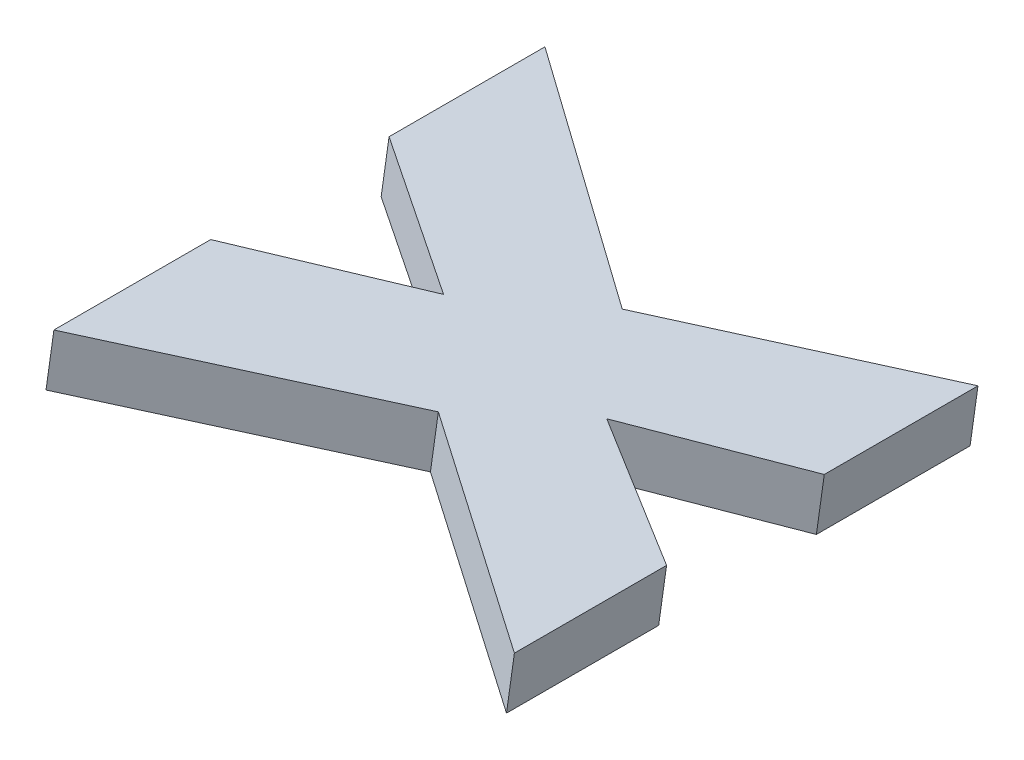
ISO-10303-21;
HEADER;
FILE_DESCRIPTION(('STEP AP214'),'2;1');
FILE_NAME('part.step','',(''),(''),'','','');
FILE_SCHEMA(('AUTOMOTIVE_DESIGN { 1 0 10303 214 1 1 1 1 }'));
ENDSEC;
DATA;
#1=APPLICATION_CONTEXT('core data for automotive mechanical design processes');
#2=APPLICATION_PROTOCOL_DEFINITION('international standard','automotive_design',2000,#1);
#3=PRODUCT_CONTEXT('',#1,'mechanical');
#4=PRODUCT('Part','Part','',(#3));
#5=PRODUCT_RELATED_PRODUCT_CATEGORY('part','',(#4));
#6=PRODUCT_DEFINITION_FORMATION('','',#4);
#7=PRODUCT_DEFINITION_CONTEXT('part definition',#1,'design');
#8=PRODUCT_DEFINITION('design','',#6,#7);
#9=PRODUCT_DEFINITION_SHAPE('','',#8);
#10=(LENGTH_UNIT() NAMED_UNIT(*) SI_UNIT(.MILLI.,.METRE.));
#11=(NAMED_UNIT(*) PLANE_ANGLE_UNIT() SI_UNIT($,.RADIAN.));
#12=(NAMED_UNIT(*) SI_UNIT($,.STERADIAN.) SOLID_ANGLE_UNIT());
#13=UNCERTAINTY_MEASURE_WITH_UNIT(LENGTH_MEASURE(1.E-05),#10,'distance_accuracy_value','');
#14=(GEOMETRIC_REPRESENTATION_CONTEXT(3) GLOBAL_UNCERTAINTY_ASSIGNED_CONTEXT((#13)) GLOBAL_UNIT_ASSIGNED_CONTEXT((#10,
#11,#12)) REPRESENTATION_CONTEXT('',''));
#15=CARTESIAN_POINT('',(0.,0.,0.));
#16=DIRECTION('',(0.,0.,1.));
#17=DIRECTION('',(1.,0.,0.));
#18=AXIS2_PLACEMENT_3D('',#15,#16,#17);
#19=CARTESIAN_POINT('',(883.709478255438,611.568026201514,1736.03406550126));
#20=DIRECTION('',(0.990268068741567,-0.139173100960088,0.));
#21=DIRECTION('',(-0.000106014336860249,-0.000754331202663265,-0.999999709872657));
#22=AXIS2_PLACEMENT_3D('',#19,#20,#21);
#23=PLANE('',#22);
#24=CARTESIAN_POINT('',(882.317747649617,601.665348387136,1736.04168294573));
#25=CARTESIAN_POINT('',(882.319191064462,601.675618817426,1749.65695866815));
#26=CARTESIAN_POINT('',(882.320634479308,601.685889247716,1763.27223439056));
#27=B_SPLINE_CURVE_WITH_KNOTS('',2,(#24,#25,#26),.UNSPECIFIED.,.F.,.F.,(3,3),(0.,1.),.UNSPECIFIED.);
#28=CARTESIAN_POINT('',(882.317747649617,601.665348387136,1736.04168294573));
#29=VERTEX_POINT('',#28);
#30=CARTESIAN_POINT('',(882.320634479308,601.685889247716,1763.27223439056));
#31=VERTEX_POINT('',#30);
#32=EDGE_CURVE('E146',#29,#31,#27,.T.);
#33=ORIENTED_EDGE('',*,*,#32,.F.);
#34=DIRECTION('',(-0.139173060582166,-0.990267781437723,0.000761744447259926));
#35=VECTOR('',#34,1.);
#36=CARTESIAN_POINT('',(883.709478255438,611.568026201514,1736.03406550126));
#37=LINE('',#36,#35);
#38=CARTESIAN_POINT('',(883.709478255438,611.568026201514,1736.03406550126));
#39=VERTEX_POINT('',#38);
#40=EDGE_CURVE('E33',#39,#29,#37,.T.);
#41=ORIENTED_EDGE('',*,*,#40,.F.);
#42=CARTESIAN_POINT('',(883.709478255438,611.568026201514,1736.03406550126));
#43=CARTESIAN_POINT('',(883.710921670284,611.578296631803,1749.64934122368));
#44=CARTESIAN_POINT('',(883.71236508513,611.588567062094,1763.26461694608));
#45=B_SPLINE_CURVE_WITH_KNOTS('',2,(#42,#43,#44),.UNSPECIFIED.,.F.,.F.,(3,3),(0.,1.),.UNSPECIFIED.);
#46=CARTESIAN_POINT('',(883.71236508513,611.588567062094,1763.26461694608));
#47=VERTEX_POINT('',#46);
#48=EDGE_CURVE('E238',#39,#47,#45,.T.);
#49=ORIENTED_EDGE('',*,*,#48,.T.);
#50=DIRECTION('',(-0.139173060582166,-0.990267781437723,0.000761744447259926));
#51=VECTOR('',#50,1.);
#52=CARTESIAN_POINT('',(883.71236508513,611.588567062094,1763.26461694608));
#53=LINE('',#52,#51);
#54=EDGE_CURVE('E11',#47,#31,#53,.T.);
#55=ORIENTED_EDGE('',*,*,#54,.T.);
#56=EDGE_LOOP('',(#33,#41,#49,#55));
#57=FACE_BOUND('',#56,.T.);
#58=ADVANCED_FACE('F17',(#57),#23,.T.);
#59=CARTESIAN_POINT('',(883.71236508513,611.588567062094,1763.26461694608));
#60=DIRECTION('',(0.493962203964204,-0.0687551214728756,0.86676067880706));
#61=DIRECTION('',(0.85827280060772,-0.12100600942788,-0.498723716519799));
#62=AXIS2_PLACEMENT_3D('',#59,#60,#61);
#63=PLANE('',#62);
#64=CARTESIAN_POINT('',(882.320634479308,601.685889247716,1763.27223439056));
#65=CARTESIAN_POINT('',(870.135548850876,603.403837882917,1770.35272346865));
#66=CARTESIAN_POINT('',(857.950463222444,605.121786518117,1777.43321254674));
#67=B_SPLINE_CURVE_WITH_KNOTS('',2,(#64,#65,#66),.UNSPECIFIED.,.F.,.F.,(3,3),(1.,2.),.UNSPECIFIED.);
#68=CARTESIAN_POINT('',(857.950463222444,605.121786518117,1777.43321254674));
#69=VERTEX_POINT('',#68);
#70=EDGE_CURVE('E154',#31,#69,#67,.T.);
#71=ORIENTED_EDGE('',*,*,#70,.F.);
#72=ORIENTED_EDGE('',*,*,#54,.F.);
#73=CARTESIAN_POINT('',(883.71236508513,611.588567062094,1763.26461694608));
#74=CARTESIAN_POINT('',(871.527279456698,613.306515697294,1770.34510602418));
#75=CARTESIAN_POINT('',(859.342193828266,615.024464332494,1777.42559510227));
#76=B_SPLINE_CURVE_WITH_KNOTS('',2,(#73,#74,#75),.UNSPECIFIED.,.F.,.F.,(3,3),(1.,2.),.UNSPECIFIED.);
#77=CARTESIAN_POINT('',(859.342193828266,615.024464332494,1777.42559510227));
#78=VERTEX_POINT('',#77);
#79=EDGE_CURVE('E258',#47,#78,#76,.T.);
#80=ORIENTED_EDGE('',*,*,#79,.T.);
#81=DIRECTION('',(-0.139173060582166,-0.990267781437723,0.000761744447259926));
#82=VECTOR('',#81,1.);
#83=CARTESIAN_POINT('',(859.342193828266,615.024464332494,1777.42559510227));
#84=LINE('',#83,#82);
#85=EDGE_CURVE('E25',#78,#69,#84,.T.);
#86=ORIENTED_EDGE('',*,*,#85,.T.);
#87=EDGE_LOOP('',(#71,#72,#80,#86));
#88=FACE_BOUND('',#87,.T.);
#89=ADVANCED_FACE('F257',(#88),#63,.T.);
#90=CARTESIAN_POINT('',(859.342193828266,615.024464332494,1777.42559510227));
#91=DIRECTION('',(0.483668298714898,-0.0686463427631782,-0.872555245496511));
#92=DIRECTION('',(-0.864115638110102,0.121067752401911,-0.488514854740284));
#93=AXIS2_PLACEMENT_3D('',#90,#91,#92);
#94=PLANE('',#93);
#95=CARTESIAN_POINT('',(857.950463222444,605.121786518117,1777.43321254674));
#96=CARTESIAN_POINT('',(870.137029869716,603.414375879527,1784.32270577301));
#97=CARTESIAN_POINT('',(882.323596516987,601.706965240937,1791.21219899928));
#98=B_SPLINE_CURVE_WITH_KNOTS('',2,(#95,#96,#97),.UNSPECIFIED.,.F.,.F.,(3,3),(2.,3.),.UNSPECIFIED.);
#99=CARTESIAN_POINT('',(882.323596516987,601.706965240937,1791.21219899928));
#100=VERTEX_POINT('',#99);
#101=EDGE_CURVE('E162',#69,#100,#98,.T.);
#102=ORIENTED_EDGE('',*,*,#101,.F.);
#103=ORIENTED_EDGE('',*,*,#85,.F.);
#104=CARTESIAN_POINT('',(859.342193828266,615.024464332494,1777.42559510227));
#105=CARTESIAN_POINT('',(871.528760475537,613.317053693904,1784.31508832854));
#106=CARTESIAN_POINT('',(883.715327122809,611.609643055314,1791.2045815548));
#107=B_SPLINE_CURVE_WITH_KNOTS('',2,(#104,#105,#106),.UNSPECIFIED.,.F.,.F.,(3,3),(2.,3.),.UNSPECIFIED.);
#108=CARTESIAN_POINT('',(883.715327122809,611.609643055314,1791.2045815548));
#109=VERTEX_POINT('',#108);
#110=EDGE_CURVE('E267',#78,#109,#107,.T.);
#111=ORIENTED_EDGE('',*,*,#110,.T.);
#112=DIRECTION('',(-0.139173060582166,-0.990267781437723,0.000761744447259926));
#113=VECTOR('',#112,1.);
#114=CARTESIAN_POINT('',(883.715327122809,611.609643055314,1791.2045815548));
#115=LINE('',#114,#113);
#116=EDGE_CURVE('E255',#109,#100,#115,.T.);
#117=ORIENTED_EDGE('',*,*,#116,.T.);
#118=EDGE_LOOP('',(#102,#103,#111,#117));
#119=FACE_BOUND('',#118,.T.);
#120=ADVANCED_FACE('F262',(#119),#94,.T.);
#121=CARTESIAN_POINT('',(883.715327122809,611.609643055314,1791.2045815548));
#122=DIRECTION('',(0.990268068741567,-0.139173100960088,0.));
#123=DIRECTION('',(-0.000106014336867244,-0.000754331202662287,-0.999999709872657));
#124=AXIS2_PLACEMENT_3D('',#121,#122,#123);
#125=PLANE('',#124);
#126=CARTESIAN_POINT('',(882.323596516987,601.706965240937,1791.21219899928));
#127=CARTESIAN_POINT('',(882.325025468758,601.717132761103,1804.69104911325));
#128=CARTESIAN_POINT('',(882.32645442053,601.72730028127,1818.16989922722));
#129=B_SPLINE_CURVE_WITH_KNOTS('',2,(#126,#127,#128),.UNSPECIFIED.,.F.,.F.,(3,3),(3.,4.),.UNSPECIFIED.);
#130=CARTESIAN_POINT('',(882.32645442053,601.72730028127,1818.16989922722));
#131=VERTEX_POINT('',#130);
#132=EDGE_CURVE('E170',#100,#131,#129,.T.);
#133=ORIENTED_EDGE('',*,*,#132,.F.);
#134=ORIENTED_EDGE('',*,*,#116,.F.);
#135=CARTESIAN_POINT('',(883.715327122809,611.609643055314,1791.2045815548));
#136=CARTESIAN_POINT('',(883.71675607458,611.619810575481,1804.68343166878));
#137=CARTESIAN_POINT('',(883.718185026351,611.629978095648,1818.16228178275));
#138=B_SPLINE_CURVE_WITH_KNOTS('',2,(#135,#136,#137),.UNSPECIFIED.,.F.,.F.,(3,3),(3.,4.),.UNSPECIFIED.);
#139=CARTESIAN_POINT('',(883.718185026351,611.629978095648,1818.16228178275));
#140=VERTEX_POINT('',#139);
#141=EDGE_CURVE('E283',#109,#140,#138,.T.);
#142=ORIENTED_EDGE('',*,*,#141,.T.);
#143=DIRECTION('',(-0.139173060582166,-0.990267781437723,0.000761744447259926));
#144=VECTOR('',#143,1.);
#145=CARTESIAN_POINT('',(883.718185026351,611.629978095648,1818.16228178275));
#146=LINE('',#145,#144);
#147=EDGE_CURVE('E253',#140,#131,#146,.T.);
#148=ORIENTED_EDGE('',*,*,#147,.T.);
#149=EDGE_LOOP('',(#133,#134,#142,#148));
#150=FACE_BOUND('',#149,.T.);
#151=ADVANCED_FACE('F351',(#150),#125,.T.);
#152=CARTESIAN_POINT('',(883.718185026351,611.629978095648,1818.16228178275));
#153=DIRECTION('',(-0.535296448896643,0.0758781245129263,0.841249203279887));
#154=DIRECTION('',(0.833119781908242,-0.116671467235185,0.540647017680068));
#155=AXIS2_PLACEMENT_3D('',#152,#153,#154);
#156=PLANE('',#155);
#157=CARTESIAN_POINT('',(882.32645442053,601.72730028127,1818.16989922722));
#158=CARTESIAN_POINT('',(863.141223784319,604.414031596718,1805.7197834669));
#159=CARTESIAN_POINT('',(843.955993148108,607.100762912166,1793.26966770658));
#160=B_SPLINE_CURVE_WITH_KNOTS('',2,(#157,#158,#159),.UNSPECIFIED.,.F.,.F.,(3,3),(4.,5.),.UNSPECIFIED.);
#161=CARTESIAN_POINT('',(843.955993148108,607.100762912166,1793.26966770658));
#162=VERTEX_POINT('',#161);
#163=EDGE_CURVE('E178',#131,#162,#160,.T.);
#164=ORIENTED_EDGE('',*,*,#163,.F.);
#165=ORIENTED_EDGE('',*,*,#147,.F.);
#166=CARTESIAN_POINT('',(883.718185026351,611.629978095648,1818.16228178275));
#167=CARTESIAN_POINT('',(864.53295439014,614.316709411096,1805.71216602243));
#168=CARTESIAN_POINT('',(845.347723753929,617.003440726544,1793.26205026211));
#169=B_SPLINE_CURVE_WITH_KNOTS('',2,(#166,#167,#168),.UNSPECIFIED.,.F.,.F.,(3,3),(4.,5.),.UNSPECIFIED.);
#170=CARTESIAN_POINT('',(845.347723753929,617.003440726544,1793.26205026211));
#171=VERTEX_POINT('',#170);
#172=EDGE_CURVE('E291',#140,#171,#169,.T.);
#173=ORIENTED_EDGE('',*,*,#172,.T.);
#174=DIRECTION('',(-0.139173060582166,-0.990267781437723,0.000761744447259926));
#175=VECTOR('',#174,1.);
#176=CARTESIAN_POINT('',(845.347723753929,617.003440726544,1793.26205026211));
#177=LINE('',#176,#175);
#178=EDGE_CURVE('E251',#171,#162,#177,.T.);
#179=ORIENTED_EDGE('',*,*,#178,.T.);
#180=EDGE_LOOP('',(#164,#165,#173,#179));
#181=FACE_BOUND('',#180,.T.);
#182=ADVANCED_FACE('F349',(#181),#156,.T.);
#183=CARTESIAN_POINT('',(845.347723753929,617.003440726544,1793.26205026211));
#184=DIRECTION('',(0.545826370188753,-0.0760690181449896,0.834438181104525));
#185=DIRECTION('',(0.826259301197127,-0.116547095737591,-0.55110102672774));
#186=AXIS2_PLACEMENT_3D('',#183,#184,#185);
#187=PLANE('',#186);
#188=CARTESIAN_POINT('',(843.955993148108,607.100762912166,1793.26966770658));
#189=CARTESIAN_POINT('',(823.530625417097,609.981840662181,1806.89304369949));
#190=CARTESIAN_POINT('',(803.105257686087,612.862918412195,1820.51641969241));
#191=B_SPLINE_CURVE_WITH_KNOTS('',2,(#188,#189,#190),.UNSPECIFIED.,.F.,.F.,(3,3),(5.,6.),.UNSPECIFIED.);
#192=CARTESIAN_POINT('',(803.105257686087,612.862918412195,1820.51641969241));
#193=VERTEX_POINT('',#192);
#194=EDGE_CURVE('E186',#162,#193,#191,.T.);
#195=ORIENTED_EDGE('',*,*,#194,.F.);
#196=ORIENTED_EDGE('',*,*,#178,.F.);
#197=CARTESIAN_POINT('',(845.347723753929,617.003440726544,1793.26205026211));
#198=CARTESIAN_POINT('',(824.922356022919,619.884518476558,1806.88542625502));
#199=CARTESIAN_POINT('',(804.496988291909,622.765596226573,1820.50880224793));
#200=B_SPLINE_CURVE_WITH_KNOTS('',2,(#197,#198,#199),.UNSPECIFIED.,.F.,.F.,(3,3),(5.,6.),.UNSPECIFIED.);
#201=CARTESIAN_POINT('',(804.496988291909,622.765596226573,1820.50880224793));
#202=VERTEX_POINT('',#201);
#203=EDGE_CURVE('E299',#171,#202,#200,.T.);
#204=ORIENTED_EDGE('',*,*,#203,.T.);
#205=DIRECTION('',(-0.139173060582166,-0.990267781437723,0.000761744447259926));
#206=VECTOR('',#205,1.);
#207=CARTESIAN_POINT('',(804.496988291909,622.765596226573,1820.50880224793));
#208=LINE('',#207,#206);
#209=EDGE_CURVE('E249',#202,#193,#208,.T.);
#210=ORIENTED_EDGE('',*,*,#209,.T.);
#211=EDGE_LOOP('',(#195,#196,#204,#210));
#212=FACE_BOUND('',#211,.T.);
#213=ADVANCED_FACE('F344',(#212),#187,.T.);
#214=CARTESIAN_POINT('',(804.496988291909,622.765596226573,1820.50880224793));
#215=DIRECTION('',(-0.990268068741567,0.139173100960088,0.));
#216=DIRECTION('',(0.000106014336865023,0.000754331202662592,0.999999709872657));
#217=AXIS2_PLACEMENT_3D('',#214,#215,#216);
#218=PLANE('',#217);
#219=CARTESIAN_POINT('',(803.105257686087,612.862918412195,1820.51641969241));
#220=CARTESIAN_POINT('',(803.103785345092,612.852442161659,1806.62829275311));
#221=CARTESIAN_POINT('',(803.102313004098,612.841965911123,1792.74016581382));
#222=B_SPLINE_CURVE_WITH_KNOTS('',2,(#219,#220,#221),.UNSPECIFIED.,.F.,.F.,(3,3),(6.,7.),.UNSPECIFIED.);
#223=CARTESIAN_POINT('',(803.102313004098,612.841965911123,1792.74016581382));
#224=VERTEX_POINT('',#223);
#225=EDGE_CURVE('E194',#193,#224,#222,.T.);
#226=ORIENTED_EDGE('',*,*,#225,.F.);
#227=ORIENTED_EDGE('',*,*,#209,.F.);
#228=CARTESIAN_POINT('',(804.496988291909,622.765596226573,1820.50880224793));
#229=CARTESIAN_POINT('',(804.495515950914,622.755119976036,1806.62067530864));
#230=CARTESIAN_POINT('',(804.494043609919,622.7446437255,1792.73254836935));
#231=B_SPLINE_CURVE_WITH_KNOTS('',2,(#228,#229,#230),.UNSPECIFIED.,.F.,.F.,(3,3),(6.,7.),.UNSPECIFIED.);
#232=CARTESIAN_POINT('',(804.494043609919,622.7446437255,1792.73254836935));
#233=VERTEX_POINT('',#232);
#234=EDGE_CURVE('E307',#202,#233,#231,.T.);
#235=ORIENTED_EDGE('',*,*,#234,.T.);
#236=DIRECTION('',(-0.139173060582166,-0.990267781437723,0.000761744447259926));
#237=VECTOR('',#236,1.);
#238=CARTESIAN_POINT('',(804.494043609919,622.7446437255,1792.73254836935));
#239=LINE('',#238,#237);
#240=EDGE_CURVE('E247',#233,#224,#239,.T.);
#241=ORIENTED_EDGE('',*,*,#240,.T.);
#242=EDGE_LOOP('',(#226,#227,#235,#241));
#243=FACE_BOUND('',#242,.T.);
#244=ADVANCED_FACE('F341',(#243),#218,.T.);
#245=CARTESIAN_POINT('',(804.494043609919,622.7446437255,1792.73254836935));
#246=DIRECTION('',(-0.518637472025848,0.0722344067515732,-0.851937417356396));
#247=DIRECTION('',(-0.843591152051057,0.118961807012412,0.52364306226046));
#248=AXIS2_PLACEMENT_3D('',#245,#246,#247);
#249=PLANE('',#248);
#250=CARTESIAN_POINT('',(803.102313004098,612.841965911123,1792.74016581382));
#251=CARTESIAN_POINT('',(815.827703706055,611.047452693241,1784.84112308509));
#252=CARTESIAN_POINT('',(828.553094408013,609.252939475359,1776.94208035635));
#253=B_SPLINE_CURVE_WITH_KNOTS('',2,(#250,#251,#252),.UNSPECIFIED.,.F.,.F.,(3,3),(7.,8.),.UNSPECIFIED.);
#254=CARTESIAN_POINT('',(828.553094408013,609.252939475359,1776.94208035635));
#255=VERTEX_POINT('',#254);
#256=EDGE_CURVE('E202',#224,#255,#253,.T.);
#257=ORIENTED_EDGE('',*,*,#256,.F.);
#258=ORIENTED_EDGE('',*,*,#240,.F.);
#259=CARTESIAN_POINT('',(804.494043609919,622.7446437255,1792.73254836935));
#260=CARTESIAN_POINT('',(817.219434311877,620.950130507618,1784.83350564061));
#261=CARTESIAN_POINT('',(829.944825013835,619.155617289736,1776.93446291188));
#262=B_SPLINE_CURVE_WITH_KNOTS('',2,(#259,#260,#261),.UNSPECIFIED.,.F.,.F.,(3,3),(7.,8.),.UNSPECIFIED.);
#263=CARTESIAN_POINT('',(829.944825013835,619.155617289736,1776.93446291188));
#264=VERTEX_POINT('',#263);
#265=EDGE_CURVE('E315',#233,#264,#262,.T.);
#266=ORIENTED_EDGE('',*,*,#265,.T.);
#267=DIRECTION('',(-0.139173060582166,-0.990267781437723,0.000761744447259926));
#268=VECTOR('',#267,1.);
#269=CARTESIAN_POINT('',(829.944825013835,619.155617289736,1776.93446291188));
#270=LINE('',#269,#268);
#271=EDGE_CURVE('E245',#264,#255,#270,.T.);
#272=ORIENTED_EDGE('',*,*,#271,.T.);
#273=EDGE_LOOP('',(#257,#258,#266,#272));
#274=FACE_BOUND('',#273,.T.);
#275=ADVANCED_FACE('F338',(#274),#249,.T.);
#276=CARTESIAN_POINT('',(829.944825013835,619.155617289736,1776.93446291188));
#277=DIRECTION('',(-0.518456836812744,0.0735196930777261,0.851937417356393));
#278=DIRECTION('',(0.843702179427265,-0.118171806181369,0.523643062260464));
#279=AXIS2_PLACEMENT_3D('',#276,#277,#278);
#280=PLANE('',#279);
#281=CARTESIAN_POINT('',(828.553094408013,609.252939475359,1776.94208035635));
#282=CARTESIAN_POINT('',(815.826028882016,611.035535700981,1769.04303762762));
#283=CARTESIAN_POINT('',(803.098963356019,612.818131926602,1761.14399489888));
#284=B_SPLINE_CURVE_WITH_KNOTS('',2,(#281,#282,#283),.UNSPECIFIED.,.F.,.F.,(3,3),(8.,9.),.UNSPECIFIED.);
#285=CARTESIAN_POINT('',(803.098963356019,612.818131926602,1761.14399489888));
#286=VERTEX_POINT('',#285);
#287=EDGE_CURVE('E210',#255,#286,#284,.T.);
#288=ORIENTED_EDGE('',*,*,#287,.F.);
#289=ORIENTED_EDGE('',*,*,#271,.F.);
#290=CARTESIAN_POINT('',(829.944825013835,619.155617289736,1776.93446291188));
#291=CARTESIAN_POINT('',(817.217759487838,620.938213515358,1769.03542018314));
#292=CARTESIAN_POINT('',(804.49069396184,622.720809740979,1761.1363774544));
#293=B_SPLINE_CURVE_WITH_KNOTS('',2,(#290,#291,#292),.UNSPECIFIED.,.F.,.F.,(3,3),(8.,9.),.UNSPECIFIED.);
#294=CARTESIAN_POINT('',(804.49069396184,622.720809740979,1761.1363774544));
#295=VERTEX_POINT('',#294);
#296=EDGE_CURVE('E128',#264,#295,#293,.T.);
#297=ORIENTED_EDGE('',*,*,#296,.T.);
#298=DIRECTION('',(-0.139173060582166,-0.990267781437723,0.000761744447259926));
#299=VECTOR('',#298,1.);
#300=CARTESIAN_POINT('',(804.49069396184,622.720809740979,1761.1363774544));
#301=LINE('',#300,#299);
#302=EDGE_CURVE('E120',#295,#286,#301,.T.);
#303=ORIENTED_EDGE('',*,*,#302,.T.);
#304=EDGE_LOOP('',(#288,#289,#297,#303));
#305=FACE_BOUND('',#304,.T.);
#306=ADVANCED_FACE('F332',(#305),#280,.T.);
#307=CARTESIAN_POINT('',(804.49069396184,622.720809740979,1761.1363774544));
#308=DIRECTION('',(-0.990268068741567,0.139173100960088,0.));
#309=DIRECTION('',(0.000106014336863358,0.000754331202662828,0.999999709872657));
#310=AXIS2_PLACEMENT_3D('',#307,#308,#309);
#311=PLANE('',#310);
#312=CARTESIAN_POINT('',(803.098963356019,612.818131926602,1761.14399489888));
#313=CARTESIAN_POINT('',(803.097499692869,612.80771742214,1747.33772332465));
#314=CARTESIAN_POINT('',(803.096036029719,612.797302917677,1733.53145175042));
#315=B_SPLINE_CURVE_WITH_KNOTS('',2,(#312,#313,#314),.UNSPECIFIED.,.F.,.F.,(3,3),(9.,10.),.UNSPECIFIED.);
#316=CARTESIAN_POINT('',(803.096036029719,612.797302917677,1733.53145175042));
#317=VERTEX_POINT('',#316);
#318=EDGE_CURVE('E218',#286,#317,#315,.T.);
#319=ORIENTED_EDGE('',*,*,#318,.F.);
#320=ORIENTED_EDGE('',*,*,#302,.F.);
#321=CARTESIAN_POINT('',(804.49069396184,622.720809740979,1761.1363774544));
#322=CARTESIAN_POINT('',(804.48923029869,622.710395236517,1747.33010588018));
#323=CARTESIAN_POINT('',(804.48776663554,622.699980732055,1733.52383430595));
#324=B_SPLINE_CURVE_WITH_KNOTS('',2,(#321,#322,#323),.UNSPECIFIED.,.F.,.F.,(3,3),(9.,10.),.UNSPECIFIED.);
#325=CARTESIAN_POINT('',(804.48776663554,622.699980732055,1733.52383430595));
#326=VERTEX_POINT('',#325);
#327=EDGE_CURVE('E123',#295,#326,#324,.T.);
#328=ORIENTED_EDGE('',*,*,#327,.T.);
#329=DIRECTION('',(-0.139173060582166,-0.990267781437723,0.000761744447259926));
#330=VECTOR('',#329,1.);
#331=CARTESIAN_POINT('',(804.48776663554,622.699980732055,1733.52383430595));
#332=LINE('',#331,#330);
#333=EDGE_CURVE('E109',#326,#317,#332,.T.);
#334=ORIENTED_EDGE('',*,*,#333,.T.);
#335=EDGE_LOOP('',(#319,#320,#328,#334));
#336=FACE_BOUND('',#335,.T.);
#337=ADVANCED_FACE('F124',(#336),#311,.T.);
#338=CARTESIAN_POINT('',(804.48776663554,622.699980732055,1733.52383430595));
#339=DIRECTION('',(0.546482378429955,-0.0774445373825513,-0.833882098198026));
#340=DIRECTION('',(-0.825825568309515,0.115637643853603,-0.551942085775541));
#341=AXIS2_PLACEMENT_3D('',#338,#339,#340);
#342=PLANE('',#341);
#343=CARTESIAN_POINT('',(803.096036029719,612.797302917677,1733.53145175042));
#344=CARTESIAN_POINT('',(823.740467534317,609.906530932044,1747.32919672412));
#345=CARTESIAN_POINT('',(844.384899038915,607.015758946411,1761.12694169782));
#346=B_SPLINE_CURVE_WITH_KNOTS('',2,(#343,#344,#345),.UNSPECIFIED.,.F.,.F.,(3,3),(10.,11.),.UNSPECIFIED.);
#347=CARTESIAN_POINT('',(844.384899038915,607.015758946411,1761.12694169782));
#348=VERTEX_POINT('',#347);
#349=EDGE_CURVE('E116',#317,#348,#346,.T.);
#350=ORIENTED_EDGE('',*,*,#349,.F.);
#351=ORIENTED_EDGE('',*,*,#333,.F.);
#352=CARTESIAN_POINT('',(804.48776663554,622.699980732055,1733.52383430595));
#353=CARTESIAN_POINT('',(825.132198140139,619.809208746421,1747.32157927965));
#354=CARTESIAN_POINT('',(845.776629644737,616.918436760788,1761.11932425335));
#355=B_SPLINE_CURVE_WITH_KNOTS('',2,(#352,#353,#354),.UNSPECIFIED.,.F.,.F.,(3,3),(10.,11.),.UNSPECIFIED.);
#356=CARTESIAN_POINT('',(845.776629644737,616.918436760788,1761.11932425335));
#357=VERTEX_POINT('',#356);
#358=EDGE_CURVE('E113',#326,#357,#355,.T.);
#359=ORIENTED_EDGE('',*,*,#358,.T.);
#360=DIRECTION('',(-0.139173060582166,-0.990267781437723,0.000761744447259926));
#361=VECTOR('',#360,1.);
#362=CARTESIAN_POINT('',(845.776629644737,616.918436760788,1761.11932425335));
#363=LINE('',#362,#361);
#364=EDGE_CURVE('E73',#357,#348,#363,.T.);
#365=ORIENTED_EDGE('',*,*,#364,.T.);
#366=EDGE_LOOP('',(#350,#351,#359,#365));
#367=FACE_BOUND('',#366,.T.);
#368=ADVANCED_FACE('F111',(#367),#342,.T.);
#369=CARTESIAN_POINT('',(845.776629644737,616.918436760788,1761.11932425335));
#370=DIRECTION('',(-0.542580492132389,0.075611181485877,-0.83659390315235));
#371=DIRECTION('',(-0.828394392041356,0.116844641643166,0.547823019736953));
#372=AXIS2_PLACEMENT_3D('',#369,#370,#371);
#373=PLANE('',#372);
#374=CARTESIAN_POINT('',(844.384899038915,607.015758946411,1761.12694169782));
#375=CARTESIAN_POINT('',(863.351323344266,604.340553666774,1748.58431232178));
#376=CARTESIAN_POINT('',(882.317747649617,601.665348387136,1736.04168294573));
#377=B_SPLINE_CURVE_WITH_KNOTS('',2,(#374,#375,#376),.UNSPECIFIED.,.F.,.F.,(3,3),(11.,12.),.UNSPECIFIED.);
#378=EDGE_CURVE('E231',#348,#29,#377,.T.);
#379=ORIENTED_EDGE('',*,*,#378,.F.);
#380=ORIENTED_EDGE('',*,*,#364,.F.);
#381=CARTESIAN_POINT('',(845.776629644737,616.918436760788,1761.11932425335));
#382=CARTESIAN_POINT('',(864.743053950088,614.243231481151,1748.57669487731));
#383=CARTESIAN_POINT('',(883.709478255438,611.568026201514,1736.03406550126));
#384=B_SPLINE_CURVE_WITH_KNOTS('',2,(#381,#382,#383),.UNSPECIFIED.,.F.,.F.,(3,3),(11.,12.),.UNSPECIFIED.);
#385=EDGE_CURVE('E132',#357,#39,#384,.T.);
#386=ORIENTED_EDGE('',*,*,#385,.T.);
#387=ORIENTED_EDGE('',*,*,#40,.T.);
#388=EDGE_LOOP('',(#379,#380,#386,#387));
#389=FACE_BOUND('',#388,.T.);
#390=ADVANCED_FACE('F438',(#389),#373,.T.);
#391=CARTESIAN_POINT('',(883.710921670284,611.578296631804,1749.64934122368));
#392=DIRECTION('',(0.13917306058217,0.990267781437722,-0.000761744447251771));
#393=DIRECTION('',(-0.947941965636703,0.133001987377295,-0.289338039563609));
#394=AXIS2_PLACEMENT_3D('',#391,#392,#393);
#395=PLANE('',#394);
#396=ORIENTED_EDGE('',*,*,#48,.F.);
#397=ORIENTED_EDGE('',*,*,#385,.F.);
#398=ORIENTED_EDGE('',*,*,#358,.F.);
#399=ORIENTED_EDGE('',*,*,#327,.F.);
#400=ORIENTED_EDGE('',*,*,#296,.F.);
#401=ORIENTED_EDGE('',*,*,#265,.F.);
#402=ORIENTED_EDGE('',*,*,#234,.F.);
#403=ORIENTED_EDGE('',*,*,#203,.F.);
#404=ORIENTED_EDGE('',*,*,#172,.F.);
#405=ORIENTED_EDGE('',*,*,#141,.F.);
#406=ORIENTED_EDGE('',*,*,#110,.F.);
#407=ORIENTED_EDGE('',*,*,#79,.F.);
#408=EDGE_LOOP('',(#396,#397,#398,#399,#400,#401,#402,#403,#404,#405,#406,#407));
#409=FACE_BOUND('',#408,.T.);
#410=ADVANCED_FACE('F131',(#409),#395,.T.);
#411=CARTESIAN_POINT('',(882.319191064462,601.675618817426,1749.65695866815));
#412=DIRECTION('',(0.13917306058217,0.990267781437722,-0.000761744447251771));
#413=DIRECTION('',(-0.947941965636703,0.133001987377295,-0.289338039563609));
#414=AXIS2_PLACEMENT_3D('',#411,#412,#413);
#415=PLANE('',#414);
#416=ORIENTED_EDGE('',*,*,#32,.T.);
#417=ORIENTED_EDGE('',*,*,#70,.T.);
#418=ORIENTED_EDGE('',*,*,#101,.T.);
#419=ORIENTED_EDGE('',*,*,#132,.T.);
#420=ORIENTED_EDGE('',*,*,#163,.T.);
#421=ORIENTED_EDGE('',*,*,#194,.T.);
#422=ORIENTED_EDGE('',*,*,#225,.T.);
#423=ORIENTED_EDGE('',*,*,#256,.T.);
#424=ORIENTED_EDGE('',*,*,#287,.T.);
#425=ORIENTED_EDGE('',*,*,#318,.T.);
#426=ORIENTED_EDGE('',*,*,#349,.T.);
#427=ORIENTED_EDGE('',*,*,#378,.T.);
#428=EDGE_LOOP('',(#416,#417,#418,#419,#420,#421,#422,#423,#424,#425,#426,#427));
#429=FACE_BOUND('',#428,.T.);
#430=ADVANCED_FACE('F265',(#429),#415,.F.);
#431=CLOSED_SHELL('',(#58,#89,#120,#151,#182,#213,#244,#275,#306,#337,#368,#390,#410,#430));
#432=MANIFOLD_SOLID_BREP('B1',#431);
#433=ADVANCED_BREP_SHAPE_REPRESENTATION('',(#18,#432),#14);
#434=SHAPE_DEFINITION_REPRESENTATION(#9,#433);
ENDSEC;
END-ISO-10303-21;
